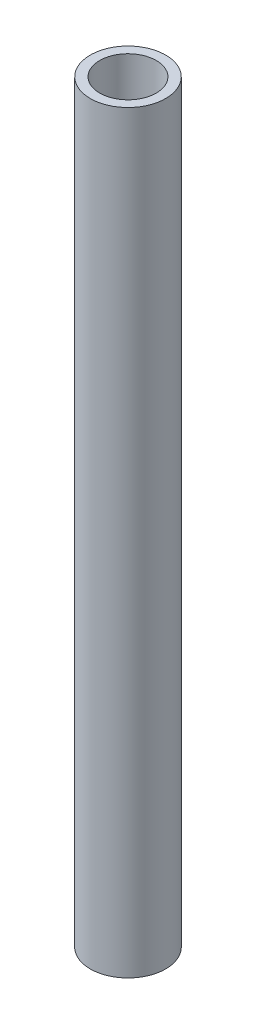
ISO-10303-21;
HEADER;
FILE_DESCRIPTION(('STEP AP214'),'2;1');
FILE_NAME('part.step','',(''),(''),'','','');
FILE_SCHEMA(('AUTOMOTIVE_DESIGN { 1 0 10303 214 1 1 1 1 }'));
ENDSEC;
DATA;
#1=APPLICATION_CONTEXT('core data for automotive mechanical design processes');
#2=APPLICATION_PROTOCOL_DEFINITION('international standard','automotive_design',2000,#1);
#3=PRODUCT_CONTEXT('',#1,'mechanical');
#4=PRODUCT('Part','Part','',(#3));
#5=PRODUCT_RELATED_PRODUCT_CATEGORY('part','',(#4));
#6=PRODUCT_DEFINITION_FORMATION('','',#4);
#7=PRODUCT_DEFINITION_CONTEXT('part definition',#1,'design');
#8=PRODUCT_DEFINITION('design','',#6,#7);
#9=PRODUCT_DEFINITION_SHAPE('','',#8);
#10=(LENGTH_UNIT() NAMED_UNIT(*) SI_UNIT(.MILLI.,.METRE.));
#11=(NAMED_UNIT(*) PLANE_ANGLE_UNIT() SI_UNIT($,.RADIAN.));
#12=(NAMED_UNIT(*) SI_UNIT($,.STERADIAN.) SOLID_ANGLE_UNIT());
#13=UNCERTAINTY_MEASURE_WITH_UNIT(LENGTH_MEASURE(1.E-05),#10,'distance_accuracy_value','');
#14=(GEOMETRIC_REPRESENTATION_CONTEXT(3) GLOBAL_UNCERTAINTY_ASSIGNED_CONTEXT((#13)) GLOBAL_UNIT_ASSIGNED_CONTEXT((#10,
#11,#12)) REPRESENTATION_CONTEXT('',''));
#15=CARTESIAN_POINT('',(0.,0.,0.));
#16=DIRECTION('',(0.,0.,1.));
#17=DIRECTION('',(1.,0.,0.));
#18=AXIS2_PLACEMENT_3D('',#15,#16,#17);
#19=CARTESIAN_POINT('',(0.,40.,0.));
#20=DIRECTION('',(0.,1.,0.));
#21=DIRECTION('',(0.,0.,1.));
#22=AXIS2_PLACEMENT_3D('',#19,#20,#21);
#23=PLANE('',#22);
#24=CARTESIAN_POINT('',(0.,40.,0.));
#25=DIRECTION('',(0.,1.,0.));
#26=DIRECTION('',(0.,0.,1.));
#27=AXIS2_PLACEMENT_3D('',#24,#25,#26);
#28=CIRCLE('',#27,2.);
#29=CARTESIAN_POINT('',(0.,40.,2.));
#30=VERTEX_POINT('',#29);
#31=EDGE_CURVE('E10',#30,#30,#28,.T.);
#32=ORIENTED_EDGE('',*,*,#31,.T.);
#33=EDGE_LOOP('',(#32));
#34=FACE_BOUND('',#33,.T.);
#35=CARTESIAN_POINT('',(0.,40.,0.));
#36=DIRECTION('',(0.,1.,0.));
#37=DIRECTION('',(0.,0.,1.));
#38=AXIS2_PLACEMENT_3D('',#35,#36,#37);
#39=CIRCLE('',#38,1.5);
#40=CARTESIAN_POINT('',(0.,40.,1.5));
#41=VERTEX_POINT('',#40);
#42=EDGE_CURVE('E42',#41,#41,#39,.T.);
#43=ORIENTED_EDGE('',*,*,#42,.F.);
#44=EDGE_LOOP('',(#43));
#45=FACE_BOUND('',#44,.T.);
#46=ADVANCED_FACE('F31',(#34,#45),#23,.T.);
#47=CARTESIAN_POINT('',(0.,0.,0.));
#48=DIRECTION('',(0.,1.,0.));
#49=DIRECTION('',(0.,0.,1.));
#50=AXIS2_PLACEMENT_3D('',#47,#48,#49);
#51=PLANE('',#50);
#52=CARTESIAN_POINT('',(0.,0.,0.));
#53=DIRECTION('',(0.,1.,0.));
#54=DIRECTION('',(0.,0.,1.));
#55=AXIS2_PLACEMENT_3D('',#52,#53,#54);
#56=CIRCLE('',#55,2.);
#57=CARTESIAN_POINT('',(0.,0.,2.));
#58=VERTEX_POINT('',#57);
#59=EDGE_CURVE('E35',#58,#58,#56,.T.);
#60=ORIENTED_EDGE('',*,*,#59,.F.);
#61=EDGE_LOOP('',(#60));
#62=FACE_BOUND('',#61,.T.);
#63=CARTESIAN_POINT('',(0.,0.,0.));
#64=DIRECTION('',(0.,1.,0.));
#65=DIRECTION('',(0.,0.,1.));
#66=AXIS2_PLACEMENT_3D('',#63,#64,#65);
#67=CIRCLE('',#66,1.5);
#68=CARTESIAN_POINT('',(0.,0.,1.5));
#69=VERTEX_POINT('',#68);
#70=EDGE_CURVE('E44',#69,#69,#67,.T.);
#71=ORIENTED_EDGE('',*,*,#70,.T.);
#72=EDGE_LOOP('',(#71));
#73=FACE_BOUND('',#72,.T.);
#74=ADVANCED_FACE('F54',(#62,#73),#51,.F.);
#75=CARTESIAN_POINT('',(0.,40.,0.));
#76=DIRECTION('',(0.,-1.,0.));
#77=DIRECTION('',(0.,0.,-1.));
#78=AXIS2_PLACEMENT_3D('',#75,#76,#77);
#79=CYLINDRICAL_SURFACE('',#78,2.);
#80=ORIENTED_EDGE('',*,*,#31,.F.);
#81=EDGE_LOOP('',(#80));
#82=FACE_BOUND('',#81,.T.);
#83=ORIENTED_EDGE('',*,*,#59,.T.);
#84=EDGE_LOOP('',(#83));
#85=FACE_BOUND('',#84,.T.);
#86=ADVANCED_FACE('F33',(#82,#85),#79,.T.);
#87=CARTESIAN_POINT('',(0.,40.,0.));
#88=DIRECTION('',(0.,-1.,0.));
#89=DIRECTION('',(0.,0.,-1.));
#90=AXIS2_PLACEMENT_3D('',#87,#88,#89);
#91=CYLINDRICAL_SURFACE('',#90,1.5);
#92=ORIENTED_EDGE('',*,*,#42,.T.);
#93=EDGE_LOOP('',(#92));
#94=FACE_BOUND('',#93,.T.);
#95=ORIENTED_EDGE('',*,*,#70,.F.);
#96=EDGE_LOOP('',(#95));
#97=FACE_BOUND('',#96,.T.);
#98=ADVANCED_FACE('F50',(#94,#97),#91,.F.);
#99=CLOSED_SHELL('',(#46,#74,#86,#98));
#100=MANIFOLD_SOLID_BREP('B2',#99);
#101=ADVANCED_BREP_SHAPE_REPRESENTATION('',(#18,#100),#14);
#102=SHAPE_DEFINITION_REPRESENTATION(#9,#101);
ENDSEC;
END-ISO-10303-21;
